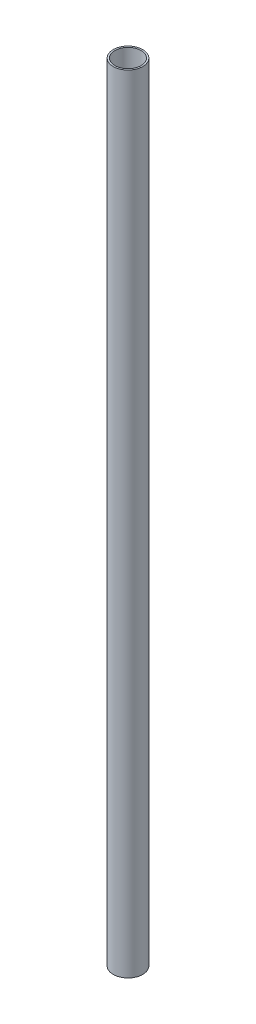
ISO-10303-21;
HEADER;
FILE_DESCRIPTION(('STEP AP214'),'2;1');
FILE_NAME('part.step','',(''),(''),'','','');
FILE_SCHEMA(('AUTOMOTIVE_DESIGN { 1 0 10303 214 1 1 1 1 }'));
ENDSEC;
DATA;
#1=APPLICATION_CONTEXT('core data for automotive mechanical design processes');
#2=APPLICATION_PROTOCOL_DEFINITION('international standard','automotive_design',2000,#1);
#3=PRODUCT_CONTEXT('',#1,'mechanical');
#4=PRODUCT('Part','Part','',(#3));
#5=PRODUCT_RELATED_PRODUCT_CATEGORY('part','',(#4));
#6=PRODUCT_DEFINITION_FORMATION('','',#4);
#7=PRODUCT_DEFINITION_CONTEXT('part definition',#1,'design');
#8=PRODUCT_DEFINITION('design','',#6,#7);
#9=PRODUCT_DEFINITION_SHAPE('','',#8);
#10=(LENGTH_UNIT() NAMED_UNIT(*) SI_UNIT(.MILLI.,.METRE.));
#11=(NAMED_UNIT(*) PLANE_ANGLE_UNIT() SI_UNIT($,.RADIAN.));
#12=(NAMED_UNIT(*) SI_UNIT($,.STERADIAN.) SOLID_ANGLE_UNIT());
#13=UNCERTAINTY_MEASURE_WITH_UNIT(LENGTH_MEASURE(1.E-05),#10,'distance_accuracy_value','');
#14=(GEOMETRIC_REPRESENTATION_CONTEXT(3) GLOBAL_UNCERTAINTY_ASSIGNED_CONTEXT((#13)) GLOBAL_UNIT_ASSIGNED_CONTEXT((#10,
#11,#12)) REPRESENTATION_CONTEXT('',''));
#15=CARTESIAN_POINT('',(0.,0.,0.));
#16=DIRECTION('',(0.,0.,1.));
#17=DIRECTION('',(1.,0.,0.));
#18=AXIS2_PLACEMENT_3D('',#15,#16,#17);
#19=CARTESIAN_POINT('',(0.,1200.,0.));
#20=DIRECTION('',(0.,-1.,0.));
#21=DIRECTION('',(0.,0.,-1.));
#22=AXIS2_PLACEMENT_3D('',#19,#20,#21);
#23=CYLINDRICAL_SURFACE('',#22,22.5);
#24=CARTESIAN_POINT('',(0.,1200.,0.));
#25=DIRECTION('',(0.,1.,0.));
#26=DIRECTION('',(0.,0.,1.));
#27=AXIS2_PLACEMENT_3D('',#24,#25,#26);
#28=CIRCLE('',#27,22.5);
#29=CARTESIAN_POINT('',(0.,1200.,22.5));
#30=VERTEX_POINT('',#29);
#31=EDGE_CURVE('E10',#30,#30,#28,.T.);
#32=ORIENTED_EDGE('',*,*,#31,.F.);
#33=EDGE_LOOP('',(#32));
#34=FACE_BOUND('',#33,.T.);
#35=CARTESIAN_POINT('',(0.,0.,0.));
#36=DIRECTION('',(0.,1.,0.));
#37=DIRECTION('',(0.,0.,1.));
#38=AXIS2_PLACEMENT_3D('',#35,#36,#37);
#39=CIRCLE('',#38,22.5);
#40=CARTESIAN_POINT('',(0.,0.,22.5));
#41=VERTEX_POINT('',#40);
#42=EDGE_CURVE('E44',#41,#41,#39,.T.);
#43=ORIENTED_EDGE('',*,*,#42,.T.);
#44=EDGE_LOOP('',(#43));
#45=FACE_BOUND('',#44,.T.);
#46=ADVANCED_FACE('F41',(#34,#45),#23,.T.);
#47=CARTESIAN_POINT('',(0.,1200.,0.));
#48=DIRECTION('',(0.,1.,0.));
#49=DIRECTION('',(0.,0.,1.));
#50=AXIS2_PLACEMENT_3D('',#47,#48,#49);
#51=PLANE('',#50);
#52=CARTESIAN_POINT('',(0.,1200.,0.));
#53=DIRECTION('',(0.,1.,0.));
#54=DIRECTION('',(0.,0.,1.));
#55=AXIS2_PLACEMENT_3D('',#52,#53,#54);
#56=CIRCLE('',#55,20.);
#57=CARTESIAN_POINT('',(0.,1200.,20.));
#58=VERTEX_POINT('',#57);
#59=EDGE_CURVE('E53',#58,#58,#56,.T.);
#60=ORIENTED_EDGE('',*,*,#59,.F.);
#61=EDGE_LOOP('',(#60));
#62=FACE_BOUND('',#61,.T.);
#63=ORIENTED_EDGE('',*,*,#31,.T.);
#64=EDGE_LOOP('',(#63));
#65=FACE_BOUND('',#64,.T.);
#66=ADVANCED_FACE('F68',(#62,#65),#51,.T.);
#67=CARTESIAN_POINT('',(0.,0.,0.));
#68=DIRECTION('',(0.,1.,0.));
#69=DIRECTION('',(0.,0.,1.));
#70=AXIS2_PLACEMENT_3D('',#67,#68,#69);
#71=PLANE('',#70);
#72=CARTESIAN_POINT('',(0.,0.,0.));
#73=DIRECTION('',(0.,1.,0.));
#74=DIRECTION('',(0.,0.,1.));
#75=AXIS2_PLACEMENT_3D('',#72,#73,#74);
#76=CIRCLE('',#75,20.);
#77=CARTESIAN_POINT('',(0.,0.,20.));
#78=VERTEX_POINT('',#77);
#79=EDGE_CURVE('E51',#78,#78,#76,.T.);
#80=ORIENTED_EDGE('',*,*,#79,.T.);
#81=EDGE_LOOP('',(#80));
#82=FACE_BOUND('',#81,.T.);
#83=ORIENTED_EDGE('',*,*,#42,.F.);
#84=EDGE_LOOP('',(#83));
#85=FACE_BOUND('',#84,.T.);
#86=ADVANCED_FACE('F59',(#82,#85),#71,.F.);
#87=CARTESIAN_POINT('',(0.,0.,0.));
#88=DIRECTION('',(0.,1.,0.));
#89=DIRECTION('',(0.,0.,1.));
#90=AXIS2_PLACEMENT_3D('',#87,#88,#89);
#91=CYLINDRICAL_SURFACE('',#90,20.);
#92=ORIENTED_EDGE('',*,*,#79,.F.);
#93=EDGE_LOOP('',(#92));
#94=FACE_BOUND('',#93,.T.);
#95=ORIENTED_EDGE('',*,*,#59,.T.);
#96=EDGE_LOOP('',(#95));
#97=FACE_BOUND('',#96,.T.);
#98=ADVANCED_FACE('F62',(#94,#97),#91,.F.);
#99=CLOSED_SHELL('',(#46,#66,#86,#98));
#100=MANIFOLD_SOLID_BREP('B2',#99);
#101=ADVANCED_BREP_SHAPE_REPRESENTATION('',(#18,#100),#14);
#102=SHAPE_DEFINITION_REPRESENTATION(#9,#101);
ENDSEC;
END-ISO-10303-21;
